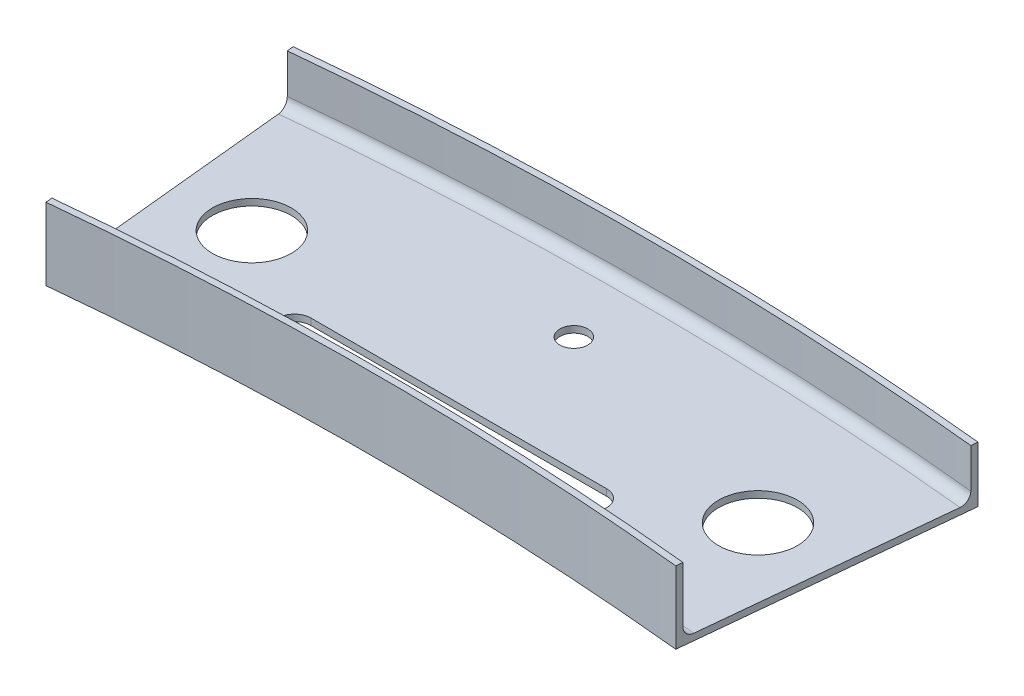
ISO-10303-21;
HEADER;
FILE_DESCRIPTION(('STEP AP214'),'2;1');
FILE_NAME('part.step','',(''),(''),'','','');
FILE_SCHEMA(('AUTOMOTIVE_DESIGN { 1 0 10303 214 1 1 1 1 }'));
ENDSEC;
DATA;
#1=APPLICATION_CONTEXT('core data for automotive mechanical design processes');
#2=APPLICATION_PROTOCOL_DEFINITION('international standard','automotive_design',2000,#1);
#3=PRODUCT_CONTEXT('',#1,'mechanical');
#4=PRODUCT('Part','Part','',(#3));
#5=PRODUCT_RELATED_PRODUCT_CATEGORY('part','',(#4));
#6=PRODUCT_DEFINITION_FORMATION('','',#4);
#7=PRODUCT_DEFINITION_CONTEXT('part definition',#1,'design');
#8=PRODUCT_DEFINITION('design','',#6,#7);
#9=PRODUCT_DEFINITION_SHAPE('','',#8);
#10=(LENGTH_UNIT() NAMED_UNIT(*) SI_UNIT(.MILLI.,.METRE.));
#11=(NAMED_UNIT(*) PLANE_ANGLE_UNIT() SI_UNIT($,.RADIAN.));
#12=(NAMED_UNIT(*) SI_UNIT($,.STERADIAN.) SOLID_ANGLE_UNIT());
#13=UNCERTAINTY_MEASURE_WITH_UNIT(LENGTH_MEASURE(1.E-05),#10,'distance_accuracy_value','');
#14=(GEOMETRIC_REPRESENTATION_CONTEXT(3) GLOBAL_UNCERTAINTY_ASSIGNED_CONTEXT((#13)) GLOBAL_UNIT_ASSIGNED_CONTEXT((#10,
#11,#12)) REPRESENTATION_CONTEXT('',''));
#15=CARTESIAN_POINT('',(0.,0.,0.));
#16=DIRECTION('',(0.,0.,1.));
#17=DIRECTION('',(1.,0.,0.));
#18=AXIS2_PLACEMENT_3D('',#15,#16,#17);
#19=CARTESIAN_POINT('',(96.3092269326684,3.,41.8154613466334));
#20=DIRECTION('',(-0.99501246882793,0.,-0.0997506234413962));
#21=DIRECTION('',(-0.0997506234413962,0.,0.99501246882793));
#22=AXIS2_PLACEMENT_3D('',#19,#20,#21);
#23=PLANE('',#22);
#24=DIRECTION('',(-0.0997506234413962,0.,0.99501246882793));
#25=VECTOR('',#24,1.);
#26=CARTESIAN_POINT('',(103.990024937656,15.,-34.8004987531172));
#27=LINE('',#26,#25);
#28=CARTESIAN_POINT('',(104.189526184539,15.,-36.790523690773));
#29=VERTEX_POINT('',#28);
#30=CARTESIAN_POINT('',(103.990024937656,15.,-34.8004987531172));
#31=VERTEX_POINT('',#30);
#32=EDGE_CURVE('E205',#29,#31,#27,.T.);
#33=ORIENTED_EDGE('',*,*,#32,.T.);
#34=DIRECTION('',(0.,-1.,0.));
#35=VECTOR('',#34,1.);
#36=CARTESIAN_POINT('',(103.990024937656,3.00000000000002,-34.8004987531172));
#37=LINE('',#36,#35);
#38=CARTESIAN_POINT('',(103.990024937656,3.00000000000002,-34.8004987531172));
#39=VERTEX_POINT('',#38);
#40=EDGE_CURVE('E213',#31,#39,#37,.T.);
#41=ORIENTED_EDGE('',*,*,#40,.T.);
#42=CARTESIAN_POINT('',(103.690773067332,3.00000000000001,-31.8154613466334));
#43=DIRECTION('',(-0.99501246882793,0.,-0.0997506234413962));
#44=DIRECTION('',(0.0997506234413962,0.,-0.99501246882793));
#45=AXIS2_PLACEMENT_3D('',#42,#43,#44);
#46=CIRCLE('',#45,3.);
#47=CARTESIAN_POINT('',(103.690773067332,0.,-31.8154613466333));
#48=VERTEX_POINT('',#47);
#49=EDGE_CURVE('E221',#39,#48,#46,.T.);
#50=ORIENTED_EDGE('',*,*,#49,.T.);
#51=DIRECTION('',(-0.0997506234413962,0.,0.99501246882793));
#52=VECTOR('',#51,1.);
#53=CARTESIAN_POINT('',(96.3092269326684,0.,41.8154613466334));
#54=LINE('',#53,#52);
#55=CARTESIAN_POINT('',(96.3092269326684,0.,41.8154613466335));
#56=VERTEX_POINT('',#55);
#57=EDGE_CURVE('E229',#48,#56,#54,.T.);
#58=ORIENTED_EDGE('',*,*,#57,.T.);
#59=CARTESIAN_POINT('',(96.3092269326684,3.,41.8154613466334));
#60=DIRECTION('',(-0.99501246882793,0.,-0.0997506234413962));
#61=DIRECTION('',(-0.0997506234413962,0.,0.99501246882793));
#62=AXIS2_PLACEMENT_3D('',#59,#60,#61);
#63=CIRCLE('',#62,3.);
#64=CARTESIAN_POINT('',(96.0099750623442,3.,44.8004987531172));
#65=VERTEX_POINT('',#64);
#66=EDGE_CURVE('E237',#56,#65,#63,.T.);
#67=ORIENTED_EDGE('',*,*,#66,.T.);
#68=DIRECTION('',(0.,1.,0.));
#69=VECTOR('',#68,1.);
#70=CARTESIAN_POINT('',(96.0099750623442,20.,44.8004987531172));
#71=LINE('',#70,#69);
#72=CARTESIAN_POINT('',(96.0099750623442,20.,44.8004987531172));
#73=VERTEX_POINT('',#72);
#74=EDGE_CURVE('E186',#65,#73,#71,.T.);
#75=ORIENTED_EDGE('',*,*,#74,.T.);
#76=DIRECTION('',(-0.0997506234413962,0.,0.99501246882793));
#77=VECTOR('',#76,1.);
#78=CARTESIAN_POINT('',(95.8104738154614,20.,46.790523690773));
#79=LINE('',#78,#77);
#80=CARTESIAN_POINT('',(95.8104738154614,20.,46.7905236907732));
#81=VERTEX_POINT('',#80);
#82=EDGE_CURVE('E170',#73,#81,#79,.T.);
#83=ORIENTED_EDGE('',*,*,#82,.T.);
#84=DIRECTION('',(0.,-1.,0.));
#85=VECTOR('',#84,1.);
#86=CARTESIAN_POINT('',(95.8104738154614,-2.00000000000001,46.790523690773));
#87=LINE('',#86,#85);
#88=CARTESIAN_POINT('',(95.8104738154614,-2.00000000000001,46.7905236907732));
#89=VERTEX_POINT('',#88);
#90=EDGE_CURVE('E173',#81,#89,#87,.T.);
#91=ORIENTED_EDGE('',*,*,#90,.T.);
#92=DIRECTION('',(0.0997506234413962,0.,-0.99501246882793));
#93=VECTOR('',#92,1.);
#94=CARTESIAN_POINT('',(104.189526184539,-2.,-36.7905236907731));
#95=LINE('',#94,#93);
#96=CARTESIAN_POINT('',(104.189526184539,-2.,-36.790523690773));
#97=VERTEX_POINT('',#96);
#98=EDGE_CURVE('E189',#89,#97,#95,.T.);
#99=ORIENTED_EDGE('',*,*,#98,.T.);
#100=DIRECTION('',(0.,1.,0.));
#101=VECTOR('',#100,1.);
#102=CARTESIAN_POINT('',(104.189526184539,15.,-36.7905236907731));
#103=LINE('',#102,#101);
#104=EDGE_CURVE('E197',#97,#29,#103,.T.);
#105=ORIENTED_EDGE('',*,*,#104,.T.);
#106=EDGE_LOOP('',(#33,#41,#50,#58,#67,#75,#83,#91,#99,#105));
#107=FACE_BOUND('',#106,.T.);
#108=ADVANCED_FACE('F33',(#107),#23,.F.);
#109=CARTESIAN_POINT('',(-96.3092269326684,3.,41.8154613466334));
#110=DIRECTION('',(-0.99501246882793,0.,0.0997506234413962));
#111=DIRECTION('',(0.0997506234413962,0.,0.99501246882793));
#112=AXIS2_PLACEMENT_3D('',#109,#110,#111);
#113=PLANE('',#112);
#114=DIRECTION('',(0.0997506234413962,0.,0.99501246882793));
#115=VECTOR('',#114,1.);
#116=CARTESIAN_POINT('',(-103.990024937656,15.,-34.8004987531172));
#117=LINE('',#116,#115);
#118=CARTESIAN_POINT('',(-104.189526184539,15.,-36.7905236907731));
#119=VERTEX_POINT('',#118);
#120=CARTESIAN_POINT('',(-103.990024937656,15.,-34.8004987531172));
#121=VERTEX_POINT('',#120);
#122=EDGE_CURVE('E207',#119,#121,#117,.T.);
#123=ORIENTED_EDGE('',*,*,#122,.F.);
#124=DIRECTION('',(0.,1.,0.));
#125=VECTOR('',#124,1.);
#126=CARTESIAN_POINT('',(-104.189526184539,15.,-36.790523690773));
#127=LINE('',#126,#125);
#128=CARTESIAN_POINT('',(-104.189526184539,-2.,-36.7905236907731));
#129=VERTEX_POINT('',#128);
#130=EDGE_CURVE('E199',#129,#119,#127,.T.);
#131=ORIENTED_EDGE('',*,*,#130,.F.);
#132=DIRECTION('',(-0.0997506234413962,0.,-0.99501246882793));
#133=VECTOR('',#132,1.);
#134=CARTESIAN_POINT('',(-104.189526184539,-2.,-36.790523690773));
#135=LINE('',#134,#133);
#136=CARTESIAN_POINT('',(-95.8104738154614,-2.00000000000001,46.7905236907731));
#137=VERTEX_POINT('',#136);
#138=EDGE_CURVE('E191',#137,#129,#135,.T.);
#139=ORIENTED_EDGE('',*,*,#138,.F.);
#140=DIRECTION('',(0.,-1.,0.));
#141=VECTOR('',#140,1.);
#142=CARTESIAN_POINT('',(-95.8104738154614,-2.00000000000001,46.7905236907731));
#143=LINE('',#142,#141);
#144=CARTESIAN_POINT('',(-95.8104738154614,20.,46.7905236907731));
#145=VERTEX_POINT('',#144);
#146=EDGE_CURVE('E177',#145,#137,#143,.T.);
#147=ORIENTED_EDGE('',*,*,#146,.F.);
#148=DIRECTION('',(0.0997506234413962,0.,0.99501246882793));
#149=VECTOR('',#148,1.);
#150=CARTESIAN_POINT('',(-95.8104738154614,20.,46.7905236907731));
#151=LINE('',#150,#149);
#152=CARTESIAN_POINT('',(-96.0099750623443,20.,44.8004987531172));
#153=VERTEX_POINT('',#152);
#154=EDGE_CURVE('E175',#153,#145,#151,.T.);
#155=ORIENTED_EDGE('',*,*,#154,.F.);
#156=DIRECTION('',(0.,1.,0.));
#157=VECTOR('',#156,1.);
#158=CARTESIAN_POINT('',(-96.0099750623442,20.,44.8004987531172));
#159=LINE('',#158,#157);
#160=CARTESIAN_POINT('',(-96.0099750623443,3.,44.8004987531172));
#161=VERTEX_POINT('',#160);
#162=EDGE_CURVE('E245',#161,#153,#159,.T.);
#163=ORIENTED_EDGE('',*,*,#162,.F.);
#164=CARTESIAN_POINT('',(-96.3092269326684,3.,41.8154613466334));
#165=DIRECTION('',(-0.99501246882793,0.,0.0997506234413962));
#166=DIRECTION('',(0.0997506234413962,0.,0.99501246882793));
#167=AXIS2_PLACEMENT_3D('',#164,#165,#166);
#168=CIRCLE('',#167,3.);
#169=CARTESIAN_POINT('',(-96.3092269326684,0.,41.8154613466335));
#170=VERTEX_POINT('',#169);
#171=EDGE_CURVE('E239',#170,#161,#168,.T.);
#172=ORIENTED_EDGE('',*,*,#171,.F.);
#173=DIRECTION('',(0.0997506234413962,0.,0.99501246882793));
#174=VECTOR('',#173,1.);
#175=CARTESIAN_POINT('',(-96.3092269326684,0.,41.8154613466334));
#176=LINE('',#175,#174);
#177=CARTESIAN_POINT('',(-103.690773067332,0.,-31.8154613466333));
#178=VERTEX_POINT('',#177);
#179=EDGE_CURVE('E231',#178,#170,#176,.T.);
#180=ORIENTED_EDGE('',*,*,#179,.F.);
#181=CARTESIAN_POINT('',(-103.690773067332,3.00000000000001,-31.8154613466334));
#182=DIRECTION('',(-0.99501246882793,0.,0.0997506234413962));
#183=DIRECTION('',(-0.0997506234413962,0.,-0.99501246882793));
#184=AXIS2_PLACEMENT_3D('',#181,#182,#183);
#185=CIRCLE('',#184,3.);
#186=CARTESIAN_POINT('',(-103.990024937656,3.00000000000002,-34.8004987531172));
#187=VERTEX_POINT('',#186);
#188=EDGE_CURVE('E223',#187,#178,#185,.T.);
#189=ORIENTED_EDGE('',*,*,#188,.F.);
#190=DIRECTION('',(0.,-1.,0.));
#191=VECTOR('',#190,1.);
#192=CARTESIAN_POINT('',(-103.990024937656,3.00000000000002,-34.8004987531172));
#193=LINE('',#192,#191);
#194=EDGE_CURVE('E215',#121,#187,#193,.T.);
#195=ORIENTED_EDGE('',*,*,#194,.F.);
#196=EDGE_LOOP('',(#123,#131,#139,#147,#155,#163,#172,#180,#189,#195));
#197=FACE_BOUND('',#196,.T.);
#198=ADVANCED_FACE('F293',(#197),#113,.T.);
#199=CARTESIAN_POINT('',(95.8104738154614,20.,46.790523690773));
#200=DIRECTION('',(0.,-1.,0.));
#201=DIRECTION('',(0.,0.,-1.));
#202=AXIS2_PLACEMENT_3D('',#199,#200,#201);
#203=PLANE('',#202);
#204=CARTESIAN_POINT('',(1.80411241501588E-13,20.,1002.5));
#205=DIRECTION('',(0.,1.,0.));
#206=DIRECTION('',(0.099750623441396,0.,-0.99501246882793));
#207=AXIS2_PLACEMENT_3D('',#204,#205,#206);
#208=CIRCLE('',#207,960.500000000004);
#209=EDGE_CURVE('E179',#81,#145,#208,.T.);
#210=ORIENTED_EDGE('',*,*,#209,.F.);
#211=ORIENTED_EDGE('',*,*,#82,.F.);
#212=CARTESIAN_POINT('',(1.80411241501588E-13,20.,1002.5));
#213=DIRECTION('',(0.,1.,0.));
#214=DIRECTION('',(0.099750623441396,0.,-0.99501246882793));
#215=AXIS2_PLACEMENT_3D('',#212,#213,#214);
#216=CIRCLE('',#215,962.500000000004);
#217=EDGE_CURVE('E183',#73,#153,#216,.T.);
#218=ORIENTED_EDGE('',*,*,#217,.T.);
#219=ORIENTED_EDGE('',*,*,#154,.T.);
#220=EDGE_LOOP('',(#210,#211,#218,#219));
#221=FACE_BOUND('',#220,.T.);
#222=ADVANCED_FACE('F295',(#221),#203,.F.);
#223=CARTESIAN_POINT('',(1.80411241501588E-13,0.,1002.5));
#224=DIRECTION('',(0.,1.,0.));
#225=DIRECTION('',(0.,0.,1.));
#226=AXIS2_PLACEMENT_3D('',#223,#224,#225);
#227=CYLINDRICAL_SURFACE('',#226,960.500000000004);
#228=CARTESIAN_POINT('',(1.80411241501588E-13,-2.00000000000001,1002.5));
#229=DIRECTION('',(0.,1.,0.));
#230=DIRECTION('',(0.099750623441396,0.,-0.99501246882793));
#231=AXIS2_PLACEMENT_3D('',#228,#229,#230);
#232=CIRCLE('',#231,960.500000000004);
#233=EDGE_CURVE('E182',#89,#137,#232,.T.);
#234=ORIENTED_EDGE('',*,*,#233,.F.);
#235=ORIENTED_EDGE('',*,*,#90,.F.);
#236=ORIENTED_EDGE('',*,*,#209,.T.);
#237=ORIENTED_EDGE('',*,*,#146,.T.);
#238=EDGE_LOOP('',(#234,#235,#236,#237));
#239=FACE_BOUND('',#238,.T.);
#240=ADVANCED_FACE('F301',(#239),#227,.F.);
#241=CARTESIAN_POINT('',(104.189526184539,-2.00000000000001,-36.7905236907731));
#242=DIRECTION('',(0.,1.,0.));
#243=DIRECTION('',(0.,0.,1.));
#244=AXIS2_PLACEMENT_3D('',#241,#242,#243);
#245=PLANE('',#244);
#246=DIRECTION('',(-1.,0.,0.));
#247=VECTOR('',#246,1.);
#248=CARTESIAN_POINT('',(-45.,-2.00000000000001,17.));
#249=LINE('',#248,#247);
#250=CARTESIAN_POINT('',(45.,-2.00000000000001,17.));
#251=VERTEX_POINT('',#250);
#252=CARTESIAN_POINT('',(-45.,-2.00000000000001,17.));
#253=VERTEX_POINT('',#252);
#254=EDGE_CURVE('E140',#251,#253,#249,.T.);
#255=ORIENTED_EDGE('',*,*,#254,.T.);
#256=CARTESIAN_POINT('',(-45.,-2.00000000000001,22.));
#257=DIRECTION('',(0.,1.,0.));
#258=DIRECTION('',(0.,0.,1.));
#259=AXIS2_PLACEMENT_3D('',#256,#257,#258);
#260=CIRCLE('',#259,5.);
#261=CARTESIAN_POINT('',(-45.,-2.00000000000001,27.));
#262=VERTEX_POINT('',#261);
#263=EDGE_CURVE('E136',#253,#262,#260,.T.);
#264=ORIENTED_EDGE('',*,*,#263,.T.);
#265=DIRECTION('',(1.,0.,0.));
#266=VECTOR('',#265,1.);
#267=CARTESIAN_POINT('',(-45.,-2.00000000000001,27.));
#268=LINE('',#267,#266);
#269=CARTESIAN_POINT('',(45.,-2.00000000000001,27.));
#270=VERTEX_POINT('',#269);
#271=EDGE_CURVE('E143',#262,#270,#268,.T.);
#272=ORIENTED_EDGE('',*,*,#271,.T.);
#273=CARTESIAN_POINT('',(45.,-2.00000000000001,22.));
#274=DIRECTION('',(0.,1.,0.));
#275=DIRECTION('',(0.,0.,1.));
#276=AXIS2_PLACEMENT_3D('',#273,#274,#275);
#277=CIRCLE('',#276,5.);
#278=EDGE_CURVE('E47',#270,#251,#277,.T.);
#279=ORIENTED_EDGE('',*,*,#278,.T.);
#280=EDGE_LOOP('',(#255,#264,#272,#279));
#281=FACE_BOUND('',#280,.T.);
#282=CARTESIAN_POINT('',(0.,-2.00000000000001,-18.));
#283=DIRECTION('',(0.,1.,0.));
#284=DIRECTION('',(0.,0.,1.));
#285=AXIS2_PLACEMENT_3D('',#282,#283,#284);
#286=CIRCLE('',#285,4.25);
#287=CARTESIAN_POINT('',(0.,-2.00000000000001,-13.75));
#288=VERTEX_POINT('',#287);
#289=EDGE_CURVE('E161',#288,#288,#286,.T.);
#290=ORIENTED_EDGE('',*,*,#289,.T.);
#291=EDGE_LOOP('',(#290));
#292=FACE_BOUND('',#291,.T.);
#293=CARTESIAN_POINT('',(77.,-2.00000000000001,2.96148148257935));
#294=DIRECTION('',(0.,1.,0.));
#295=DIRECTION('',(0.,0.,1.));
#296=AXIS2_PLACEMENT_3D('',#293,#294,#295);
#297=CIRCLE('',#296,12.);
#298=CARTESIAN_POINT('',(77.,-2.00000000000001,14.9614814825794));
#299=VERTEX_POINT('',#298);
#300=EDGE_CURVE('E165',#299,#299,#297,.T.);
#301=ORIENTED_EDGE('',*,*,#300,.T.);
#302=EDGE_LOOP('',(#301));
#303=FACE_BOUND('',#302,.T.);
#304=CARTESIAN_POINT('',(-77.,-2.00000000000001,2.96148148257935));
#305=DIRECTION('',(0.,1.,0.));
#306=DIRECTION('',(0.,0.,1.));
#307=AXIS2_PLACEMENT_3D('',#304,#305,#306);
#308=CIRCLE('',#307,12.);
#309=CARTESIAN_POINT('',(-77.,-2.00000000000001,14.9614814825793));
#310=VERTEX_POINT('',#309);
#311=EDGE_CURVE('E156',#310,#310,#308,.T.);
#312=ORIENTED_EDGE('',*,*,#311,.T.);
#313=EDGE_LOOP('',(#312));
#314=FACE_BOUND('',#313,.T.);
#315=CARTESIAN_POINT('',(1.80411241501588E-13,-2.,1002.5));
#316=DIRECTION('',(0.,1.,0.));
#317=DIRECTION('',(0.099750623441396,0.,-0.99501246882793));
#318=AXIS2_PLACEMENT_3D('',#315,#316,#317);
#319=CIRCLE('',#318,1044.5);
#320=EDGE_CURVE('E194',#97,#129,#319,.T.);
#321=ORIENTED_EDGE('',*,*,#320,.F.);
#322=ORIENTED_EDGE('',*,*,#98,.F.);
#323=ORIENTED_EDGE('',*,*,#233,.T.);
#324=ORIENTED_EDGE('',*,*,#138,.T.);
#325=EDGE_LOOP('',(#321,#322,#323,#324));
#326=FACE_BOUND('',#325,.T.);
#327=ADVANCED_FACE('F147',(#281,#292,#303,#314,#326),#245,.F.);
#328=CARTESIAN_POINT('',(1.80411241501588E-13,0.,1002.5));
#329=DIRECTION('',(0.,1.,0.));
#330=DIRECTION('',(0.,0.,1.));
#331=AXIS2_PLACEMENT_3D('',#328,#329,#330);
#332=CYLINDRICAL_SURFACE('',#331,1044.5);
#333=CARTESIAN_POINT('',(1.80411241501588E-13,15.,1002.5));
#334=DIRECTION('',(0.,1.,0.));
#335=DIRECTION('',(0.099750623441396,0.,-0.99501246882793));
#336=AXIS2_PLACEMENT_3D('',#333,#334,#335);
#337=CIRCLE('',#336,1044.5);
#338=EDGE_CURVE('E202',#29,#119,#337,.T.);
#339=ORIENTED_EDGE('',*,*,#338,.F.);
#340=ORIENTED_EDGE('',*,*,#104,.F.);
#341=ORIENTED_EDGE('',*,*,#320,.T.);
#342=ORIENTED_EDGE('',*,*,#130,.T.);
#343=EDGE_LOOP('',(#339,#340,#341,#342));
#344=FACE_BOUND('',#343,.T.);
#345=ADVANCED_FACE('F315',(#344),#332,.T.);
#346=CARTESIAN_POINT('',(103.990024937656,15.,-34.8004987531172));
#347=DIRECTION('',(0.,-1.,0.));
#348=DIRECTION('',(0.,0.,-1.));
#349=AXIS2_PLACEMENT_3D('',#346,#347,#348);
#350=PLANE('',#349);
#351=CARTESIAN_POINT('',(1.80411241501588E-13,15.,1002.5));
#352=DIRECTION('',(0.,1.,0.));
#353=DIRECTION('',(0.099750623441396,0.,-0.99501246882793));
#354=AXIS2_PLACEMENT_3D('',#351,#352,#353);
#355=CIRCLE('',#354,1042.5);
#356=EDGE_CURVE('E210',#31,#121,#355,.T.);
#357=ORIENTED_EDGE('',*,*,#356,.F.);
#358=ORIENTED_EDGE('',*,*,#32,.F.);
#359=ORIENTED_EDGE('',*,*,#338,.T.);
#360=ORIENTED_EDGE('',*,*,#122,.T.);
#361=EDGE_LOOP('',(#357,#358,#359,#360));
#362=FACE_BOUND('',#361,.T.);
#363=ADVANCED_FACE('F313',(#362),#350,.F.);
#364=CARTESIAN_POINT('',(1.80411241501588E-13,0.,1002.5));
#365=DIRECTION('',(0.,1.,0.));
#366=DIRECTION('',(0.,0.,1.));
#367=AXIS2_PLACEMENT_3D('',#364,#365,#366);
#368=CYLINDRICAL_SURFACE('',#367,1042.5);
#369=CARTESIAN_POINT('',(1.80411241501588E-13,3.00000000000002,1002.5));
#370=DIRECTION('',(0.,1.,0.));
#371=DIRECTION('',(0.099750623441396,0.,-0.99501246882793));
#372=AXIS2_PLACEMENT_3D('',#369,#370,#371);
#373=CIRCLE('',#372,1042.5);
#374=EDGE_CURVE('E218',#39,#187,#373,.T.);
#375=ORIENTED_EDGE('',*,*,#374,.F.);
#376=ORIENTED_EDGE('',*,*,#40,.F.);
#377=ORIENTED_EDGE('',*,*,#356,.T.);
#378=ORIENTED_EDGE('',*,*,#194,.T.);
#379=EDGE_LOOP('',(#375,#376,#377,#378));
#380=FACE_BOUND('',#379,.T.);
#381=ADVANCED_FACE('F335',(#380),#368,.F.);
#382=CARTESIAN_POINT('',(1.80411241501588E-13,3.00000000000001,1002.5));
#383=DIRECTION('',(0.,1.,0.));
#384=DIRECTION('',(0.,0.,1.));
#385=AXIS2_PLACEMENT_3D('',#382,#383,#384);
#386=TOROIDAL_SURFACE('',#385,1039.5,3.);
#387=CARTESIAN_POINT('',(1.80411241501588E-13,0.,1002.5));
#388=DIRECTION('',(0.,1.,0.));
#389=DIRECTION('',(0.099750623441396,0.,-0.99501246882793));
#390=AXIS2_PLACEMENT_3D('',#387,#388,#389);
#391=CIRCLE('',#390,1039.5);
#392=EDGE_CURVE('E226',#48,#178,#391,.T.);
#393=ORIENTED_EDGE('',*,*,#392,.F.);
#394=ORIENTED_EDGE('',*,*,#49,.F.);
#395=ORIENTED_EDGE('',*,*,#374,.T.);
#396=ORIENTED_EDGE('',*,*,#188,.T.);
#397=EDGE_LOOP('',(#393,#394,#395,#396));
#398=FACE_BOUND('',#397,.T.);
#399=ADVANCED_FACE('F332',(#398),#386,.F.);
#400=CARTESIAN_POINT('',(96.3092269326684,0.,41.8154613466334));
#401=DIRECTION('',(0.,-1.,0.));
#402=DIRECTION('',(0.,0.,-1.));
#403=AXIS2_PLACEMENT_3D('',#400,#401,#402);
#404=PLANE('',#403);
#405=DIRECTION('',(-1.,0.,0.));
#406=VECTOR('',#405,1.);
#407=CARTESIAN_POINT('',(96.3092269326684,0.,27.));
#408=LINE('',#407,#406);
#409=CARTESIAN_POINT('',(45.,0.,27.));
#410=VERTEX_POINT('',#409);
#411=CARTESIAN_POINT('',(-45.,0.,27.));
#412=VERTEX_POINT('',#411);
#413=EDGE_CURVE('E251',#410,#412,#408,.T.);
#414=ORIENTED_EDGE('',*,*,#413,.T.);
#415=CARTESIAN_POINT('',(-45.,0.,22.));
#416=DIRECTION('',(0.,-1.,0.));
#417=DIRECTION('',(0.,0.,-1.));
#418=AXIS2_PLACEMENT_3D('',#415,#416,#417);
#419=CIRCLE('',#418,5.);
#420=CARTESIAN_POINT('',(-45.,0.,17.));
#421=VERTEX_POINT('',#420);
#422=EDGE_CURVE('E11',#412,#421,#419,.T.);
#423=ORIENTED_EDGE('',*,*,#422,.T.);
#424=DIRECTION('',(1.,0.,0.));
#425=VECTOR('',#424,1.);
#426=CARTESIAN_POINT('',(96.3092269326684,0.,17.));
#427=LINE('',#426,#425);
#428=CARTESIAN_POINT('',(45.,0.,17.));
#429=VERTEX_POINT('',#428);
#430=EDGE_CURVE('E40',#421,#429,#427,.T.);
#431=ORIENTED_EDGE('',*,*,#430,.T.);
#432=CARTESIAN_POINT('',(45.,0.,22.));
#433=DIRECTION('',(0.,-1.,0.));
#434=DIRECTION('',(0.,0.,-1.));
#435=AXIS2_PLACEMENT_3D('',#432,#433,#434);
#436=CIRCLE('',#435,5.);
#437=EDGE_CURVE('E260',#429,#410,#436,.T.);
#438=ORIENTED_EDGE('',*,*,#437,.T.);
#439=EDGE_LOOP('',(#414,#423,#431,#438));
#440=FACE_BOUND('',#439,.T.);
#441=CARTESIAN_POINT('',(0.,0.,-18.));
#442=DIRECTION('',(0.,-1.,0.));
#443=DIRECTION('',(0.,0.,-1.));
#444=AXIS2_PLACEMENT_3D('',#441,#442,#443);
#445=CIRCLE('',#444,4.25);
#446=CARTESIAN_POINT('',(0.,0.,-22.25));
#447=VERTEX_POINT('',#446);
#448=EDGE_CURVE('E174',#447,#447,#445,.T.);
#449=ORIENTED_EDGE('',*,*,#448,.T.);
#450=EDGE_LOOP('',(#449));
#451=FACE_BOUND('',#450,.T.);
#452=CARTESIAN_POINT('',(77.,0.,2.96148148257935));
#453=DIRECTION('',(0.,-1.,0.));
#454=DIRECTION('',(0.,0.,-1.));
#455=AXIS2_PLACEMENT_3D('',#452,#453,#454);
#456=CIRCLE('',#455,12.);
#457=CARTESIAN_POINT('',(77.,0.,-9.03851851742067));
#458=VERTEX_POINT('',#457);
#459=EDGE_CURVE('E254',#458,#458,#456,.T.);
#460=ORIENTED_EDGE('',*,*,#459,.T.);
#461=EDGE_LOOP('',(#460));
#462=FACE_BOUND('',#461,.T.);
#463=CARTESIAN_POINT('',(-77.,0.,2.96148148257935));
#464=DIRECTION('',(0.,-1.,0.));
#465=DIRECTION('',(0.,0.,-1.));
#466=AXIS2_PLACEMENT_3D('',#463,#464,#465);
#467=CIRCLE('',#466,12.);
#468=CARTESIAN_POINT('',(-77.,0.,-9.03851851742064));
#469=VERTEX_POINT('',#468);
#470=EDGE_CURVE('E164',#469,#469,#467,.T.);
#471=ORIENTED_EDGE('',*,*,#470,.T.);
#472=EDGE_LOOP('',(#471));
#473=FACE_BOUND('',#472,.T.);
#474=CARTESIAN_POINT('',(1.80411241501588E-13,0.,1002.5));
#475=DIRECTION('',(0.,1.,0.));
#476=DIRECTION('',(0.099750623441396,0.,-0.99501246882793));
#477=AXIS2_PLACEMENT_3D('',#474,#475,#476);
#478=CIRCLE('',#477,965.500000000004);
#479=EDGE_CURVE('E234',#56,#170,#478,.T.);
#480=ORIENTED_EDGE('',*,*,#479,.F.);
#481=ORIENTED_EDGE('',*,*,#57,.F.);
#482=ORIENTED_EDGE('',*,*,#392,.T.);
#483=ORIENTED_EDGE('',*,*,#179,.T.);
#484=EDGE_LOOP('',(#480,#481,#482,#483));
#485=FACE_BOUND('',#484,.T.);
#486=ADVANCED_FACE('F264',(#440,#451,#462,#473,#485),#404,.F.);
#487=CARTESIAN_POINT('',(1.80411241501588E-13,3.,1002.5));
#488=DIRECTION('',(0.,1.,0.));
#489=DIRECTION('',(0.,0.,1.));
#490=AXIS2_PLACEMENT_3D('',#487,#488,#489);
#491=TOROIDAL_SURFACE('',#490,965.500000000004,3.);
#492=CARTESIAN_POINT('',(1.80411241501588E-13,3.,1002.5));
#493=DIRECTION('',(0.,1.,0.));
#494=DIRECTION('',(0.099750623441396,0.,-0.99501246882793));
#495=AXIS2_PLACEMENT_3D('',#492,#493,#494);
#496=CIRCLE('',#495,962.500000000004);
#497=EDGE_CURVE('E178',#65,#161,#496,.T.);
#498=ORIENTED_EDGE('',*,*,#497,.F.);
#499=ORIENTED_EDGE('',*,*,#66,.F.);
#500=ORIENTED_EDGE('',*,*,#479,.T.);
#501=ORIENTED_EDGE('',*,*,#171,.T.);
#502=EDGE_LOOP('',(#498,#499,#500,#501));
#503=FACE_BOUND('',#502,.T.);
#504=ADVANCED_FACE('F280',(#503),#491,.F.);
#505=CARTESIAN_POINT('',(1.80411241501588E-13,0.,1002.5));
#506=DIRECTION('',(0.,1.,0.));
#507=DIRECTION('',(0.,0.,1.));
#508=AXIS2_PLACEMENT_3D('',#505,#506,#507);
#509=CYLINDRICAL_SURFACE('',#508,962.500000000004);
#510=ORIENTED_EDGE('',*,*,#162,.T.);
#511=ORIENTED_EDGE('',*,*,#217,.F.);
#512=ORIENTED_EDGE('',*,*,#74,.F.);
#513=ORIENTED_EDGE('',*,*,#497,.T.);
#514=EDGE_LOOP('',(#510,#511,#512,#513));
#515=FACE_BOUND('',#514,.T.);
#516=ADVANCED_FACE('F277',(#515),#509,.T.);
#517=CARTESIAN_POINT('',(-77.,-2.00000000000001,2.96148148257935));
#518=DIRECTION('',(0.,1.,0.));
#519=DIRECTION('',(0.,0.,1.));
#520=AXIS2_PLACEMENT_3D('',#517,#518,#519);
#521=CYLINDRICAL_SURFACE('',#520,12.);
#522=ORIENTED_EDGE('',*,*,#311,.F.);
#523=EDGE_LOOP('',(#522));
#524=FACE_BOUND('',#523,.T.);
#525=ORIENTED_EDGE('',*,*,#470,.F.);
#526=EDGE_LOOP('',(#525));
#527=FACE_BOUND('',#526,.T.);
#528=ADVANCED_FACE('F279',(#524,#527),#521,.F.);
#529=CARTESIAN_POINT('',(77.,-2.00000000000001,2.96148148257935));
#530=DIRECTION('',(0.,1.,0.));
#531=DIRECTION('',(0.,0.,1.));
#532=AXIS2_PLACEMENT_3D('',#529,#530,#531);
#533=CYLINDRICAL_SURFACE('',#532,12.);
#534=ORIENTED_EDGE('',*,*,#300,.F.);
#535=EDGE_LOOP('',(#534));
#536=FACE_BOUND('',#535,.T.);
#537=ORIENTED_EDGE('',*,*,#459,.F.);
#538=EDGE_LOOP('',(#537));
#539=FACE_BOUND('',#538,.T.);
#540=ADVANCED_FACE('F287',(#536,#539),#533,.F.);
#541=CARTESIAN_POINT('',(0.,-2.00000000000001,-18.));
#542=DIRECTION('',(0.,1.,0.));
#543=DIRECTION('',(0.,0.,1.));
#544=AXIS2_PLACEMENT_3D('',#541,#542,#543);
#545=CYLINDRICAL_SURFACE('',#544,4.25);
#546=ORIENTED_EDGE('',*,*,#289,.F.);
#547=EDGE_LOOP('',(#546));
#548=FACE_BOUND('',#547,.T.);
#549=ORIENTED_EDGE('',*,*,#448,.F.);
#550=EDGE_LOOP('',(#549));
#551=FACE_BOUND('',#550,.T.);
#552=ADVANCED_FACE('F377',(#548,#551),#545,.F.);
#553=CARTESIAN_POINT('',(-45.,-2.00000000000001,22.));
#554=DIRECTION('',(0.,1.,0.));
#555=DIRECTION('',(0.,0.,1.));
#556=AXIS2_PLACEMENT_3D('',#553,#554,#555);
#557=CYLINDRICAL_SURFACE('',#556,5.);
#558=DIRECTION('',(0.,1.,0.));
#559=VECTOR('',#558,1.);
#560=CARTESIAN_POINT('',(-45.,-2.00000000000001,27.));
#561=LINE('',#560,#559);
#562=EDGE_CURVE('E55',#262,#412,#561,.T.);
#563=ORIENTED_EDGE('',*,*,#562,.F.);
#564=ORIENTED_EDGE('',*,*,#263,.F.);
#565=DIRECTION('',(0.,1.,0.));
#566=VECTOR('',#565,1.);
#567=CARTESIAN_POINT('',(-45.,-2.00000000000001,17.));
#568=LINE('',#567,#566);
#569=EDGE_CURVE('E154',#253,#421,#568,.T.);
#570=ORIENTED_EDGE('',*,*,#569,.T.);
#571=ORIENTED_EDGE('',*,*,#422,.F.);
#572=EDGE_LOOP('',(#563,#564,#570,#571));
#573=FACE_BOUND('',#572,.T.);
#574=ADVANCED_FACE('F133',(#573),#557,.F.);
#575=CARTESIAN_POINT('',(-45.,-2.00000000000001,17.));
#576=DIRECTION('',(0.,0.,-1.));
#577=DIRECTION('',(-1.,0.,0.));
#578=AXIS2_PLACEMENT_3D('',#575,#576,#577);
#579=PLANE('',#578);
#580=ORIENTED_EDGE('',*,*,#569,.F.);
#581=ORIENTED_EDGE('',*,*,#254,.F.);
#582=DIRECTION('',(0.,1.,0.));
#583=VECTOR('',#582,1.);
#584=CARTESIAN_POINT('',(45.,-2.00000000000001,17.));
#585=LINE('',#584,#583);
#586=EDGE_CURVE('E157',#251,#429,#585,.T.);
#587=ORIENTED_EDGE('',*,*,#586,.T.);
#588=ORIENTED_EDGE('',*,*,#430,.F.);
#589=EDGE_LOOP('',(#580,#581,#587,#588));
#590=FACE_BOUND('',#589,.T.);
#591=ADVANCED_FACE('F267',(#590),#579,.F.);
#592=CARTESIAN_POINT('',(45.,-2.00000000000001,22.));
#593=DIRECTION('',(0.,1.,0.));
#594=DIRECTION('',(0.,0.,1.));
#595=AXIS2_PLACEMENT_3D('',#592,#593,#594);
#596=CYLINDRICAL_SURFACE('',#595,5.);
#597=ORIENTED_EDGE('',*,*,#586,.F.);
#598=ORIENTED_EDGE('',*,*,#278,.F.);
#599=DIRECTION('',(0.,1.,0.));
#600=VECTOR('',#599,1.);
#601=CARTESIAN_POINT('',(45.,-2.00000000000001,27.));
#602=LINE('',#601,#600);
#603=EDGE_CURVE('E139',#270,#410,#602,.T.);
#604=ORIENTED_EDGE('',*,*,#603,.T.);
#605=ORIENTED_EDGE('',*,*,#437,.F.);
#606=EDGE_LOOP('',(#597,#598,#604,#605));
#607=FACE_BOUND('',#606,.T.);
#608=ADVANCED_FACE('F268',(#607),#596,.F.);
#609=CARTESIAN_POINT('',(-45.,-2.00000000000001,27.));
#610=DIRECTION('',(0.,0.,1.));
#611=DIRECTION('',(1.,0.,0.));
#612=AXIS2_PLACEMENT_3D('',#609,#610,#611);
#613=PLANE('',#612);
#614=ORIENTED_EDGE('',*,*,#603,.F.);
#615=ORIENTED_EDGE('',*,*,#271,.F.);
#616=ORIENTED_EDGE('',*,*,#562,.T.);
#617=ORIENTED_EDGE('',*,*,#413,.F.);
#618=EDGE_LOOP('',(#614,#615,#616,#617));
#619=FACE_BOUND('',#618,.T.);
#620=ADVANCED_FACE('F144',(#619),#613,.F.);
#621=CLOSED_SHELL('',(#108,#198,#222,#240,#327,#345,#363,#381,#399,#486,#504,#516,#528,#540,
#552,#574,#591,#608,#620));
#622=MANIFOLD_SOLID_BREP('B2',#621);
#623=ADVANCED_BREP_SHAPE_REPRESENTATION('',(#18,#622),#14);
#624=SHAPE_DEFINITION_REPRESENTATION(#9,#623);
ENDSEC;
END-ISO-10303-21;
